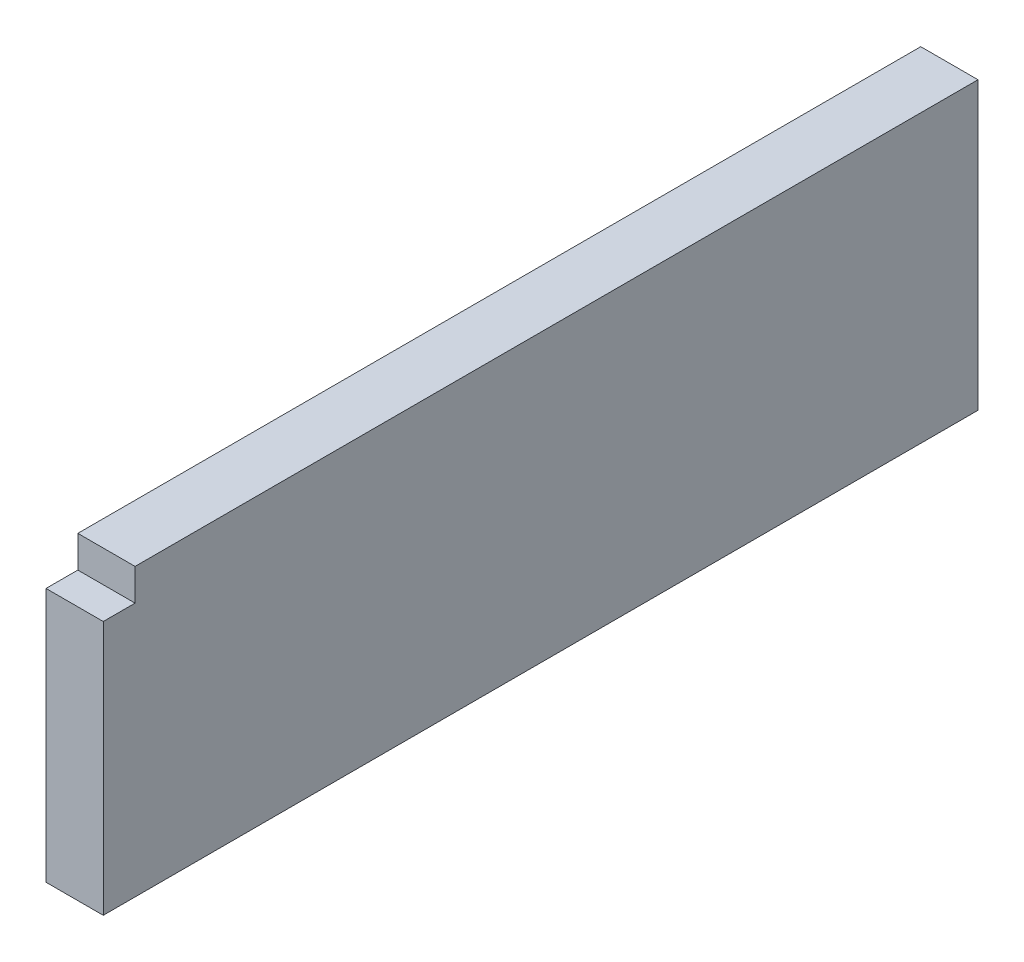
ISO-10303-21;
HEADER;
FILE_DESCRIPTION(('STEP AP214'),'2;1');
FILE_NAME('part.step','',(''),(''),'','','');
FILE_SCHEMA(('AUTOMOTIVE_DESIGN { 1 0 10303 214 1 1 1 1 }'));
ENDSEC;
DATA;
#1=APPLICATION_CONTEXT('core data for automotive mechanical design processes');
#2=APPLICATION_PROTOCOL_DEFINITION('international standard','automotive_design',2000,#1);
#3=PRODUCT_CONTEXT('',#1,'mechanical');
#4=PRODUCT('Part','Part','',(#3));
#5=PRODUCT_RELATED_PRODUCT_CATEGORY('part','',(#4));
#6=PRODUCT_DEFINITION_FORMATION('','',#4);
#7=PRODUCT_DEFINITION_CONTEXT('part definition',#1,'design');
#8=PRODUCT_DEFINITION('design','',#6,#7);
#9=PRODUCT_DEFINITION_SHAPE('','',#8);
#10=(LENGTH_UNIT() NAMED_UNIT(*) SI_UNIT(.MILLI.,.METRE.));
#11=(NAMED_UNIT(*) PLANE_ANGLE_UNIT() SI_UNIT($,.RADIAN.));
#12=(NAMED_UNIT(*) SI_UNIT($,.STERADIAN.) SOLID_ANGLE_UNIT());
#13=UNCERTAINTY_MEASURE_WITH_UNIT(LENGTH_MEASURE(1.E-05),#10,'distance_accuracy_value','');
#14=(GEOMETRIC_REPRESENTATION_CONTEXT(3) GLOBAL_UNCERTAINTY_ASSIGNED_CONTEXT((#13)) GLOBAL_UNIT_ASSIGNED_CONTEXT((#10,
#11,#12)) REPRESENTATION_CONTEXT('',''));
#15=CARTESIAN_POINT('',(0.,0.,0.));
#16=DIRECTION('',(0.,0.,1.));
#17=DIRECTION('',(1.,0.,0.));
#18=AXIS2_PLACEMENT_3D('',#15,#16,#17);
#19=CARTESIAN_POINT('',(9.,45.,127.5));
#20=DIRECTION('',(0.,-1.,0.));
#21=DIRECTION('',(0.,0.,-1.));
#22=AXIS2_PLACEMENT_3D('',#19,#20,#21);
#23=PLANE('',#22);
#24=DIRECTION('',(0.,0.,1.));
#25=VECTOR('',#24,1.);
#26=CARTESIAN_POINT('',(-9.,45.,127.5));
#27=LINE('',#26,#25);
#28=CARTESIAN_POINT('',(-9.,45.,-137.5));
#29=VERTEX_POINT('',#28);
#30=CARTESIAN_POINT('',(-9.,45.,127.5));
#31=VERTEX_POINT('',#30);
#32=EDGE_CURVE('E130',#29,#31,#27,.T.);
#33=ORIENTED_EDGE('',*,*,#32,.T.);
#34=DIRECTION('',(-1.,0.,0.));
#35=VECTOR('',#34,1.);
#36=CARTESIAN_POINT('',(9.,45.,127.5));
#37=LINE('',#36,#35);
#38=CARTESIAN_POINT('',(9.,45.,127.5));
#39=VERTEX_POINT('',#38);
#40=EDGE_CURVE('E11',#39,#31,#37,.T.);
#41=ORIENTED_EDGE('',*,*,#40,.F.);
#42=DIRECTION('',(0.,0.,1.));
#43=VECTOR('',#42,1.);
#44=CARTESIAN_POINT('',(9.,45.,127.5));
#45=LINE('',#44,#43);
#46=CARTESIAN_POINT('',(9.,45.,-137.5));
#47=VERTEX_POINT('',#46);
#48=EDGE_CURVE('E146',#47,#39,#45,.T.);
#49=ORIENTED_EDGE('',*,*,#48,.F.);
#50=DIRECTION('',(-1.,0.,0.));
#51=VECTOR('',#50,1.);
#52=CARTESIAN_POINT('',(9.,45.,-137.5));
#53=LINE('',#52,#51);
#54=EDGE_CURVE('E126',#47,#29,#53,.T.);
#55=ORIENTED_EDGE('',*,*,#54,.T.);
#56=EDGE_LOOP('',(#33,#41,#49,#55));
#57=FACE_BOUND('',#56,.T.);
#58=ADVANCED_FACE('F41',(#57),#23,.F.);
#59=CARTESIAN_POINT('',(9.,45.,127.5));
#60=DIRECTION('',(0.,0.,-1.));
#61=DIRECTION('',(-1.,0.,0.));
#62=AXIS2_PLACEMENT_3D('',#59,#60,#61);
#63=PLANE('',#62);
#64=DIRECTION('',(0.,-1.,0.));
#65=VECTOR('',#64,1.);
#66=CARTESIAN_POINT('',(-9.,45.,127.5));
#67=LINE('',#66,#65);
#68=CARTESIAN_POINT('',(-9.,35.,127.5));
#69=VERTEX_POINT('',#68);
#70=EDGE_CURVE('E134',#31,#69,#67,.T.);
#71=ORIENTED_EDGE('',*,*,#70,.T.);
#72=DIRECTION('',(-1.,0.,0.));
#73=VECTOR('',#72,1.);
#74=CARTESIAN_POINT('',(9.,35.,127.5));
#75=LINE('',#74,#73);
#76=CARTESIAN_POINT('',(9.,35.,127.5));
#77=VERTEX_POINT('',#76);
#78=EDGE_CURVE('E50',#77,#69,#75,.T.);
#79=ORIENTED_EDGE('',*,*,#78,.F.);
#80=DIRECTION('',(0.,-1.,0.));
#81=VECTOR('',#80,1.);
#82=CARTESIAN_POINT('',(9.,45.,127.5));
#83=LINE('',#82,#81);
#84=EDGE_CURVE('E95',#39,#77,#83,.T.);
#85=ORIENTED_EDGE('',*,*,#84,.F.);
#86=ORIENTED_EDGE('',*,*,#40,.T.);
#87=EDGE_LOOP('',(#71,#79,#85,#86));
#88=FACE_BOUND('',#87,.T.);
#89=ADVANCED_FACE('F174',(#88),#63,.F.);
#90=CARTESIAN_POINT('',(9.,35.,137.5));
#91=DIRECTION('',(0.,-1.,0.));
#92=DIRECTION('',(0.,0.,-1.));
#93=AXIS2_PLACEMENT_3D('',#90,#91,#92);
#94=PLANE('',#93);
#95=DIRECTION('',(0.,0.,1.));
#96=VECTOR('',#95,1.);
#97=CARTESIAN_POINT('',(-9.,35.,137.5));
#98=LINE('',#97,#96);
#99=CARTESIAN_POINT('',(-9.,35.,137.5));
#100=VERTEX_POINT('',#99);
#101=EDGE_CURVE('E137',#69,#100,#98,.T.);
#102=ORIENTED_EDGE('',*,*,#101,.T.);
#103=DIRECTION('',(-1.,0.,0.));
#104=VECTOR('',#103,1.);
#105=CARTESIAN_POINT('',(9.,35.,137.5));
#106=LINE('',#105,#104);
#107=CARTESIAN_POINT('',(9.,35.,137.5));
#108=VERTEX_POINT('',#107);
#109=EDGE_CURVE('E119',#108,#100,#106,.T.);
#110=ORIENTED_EDGE('',*,*,#109,.F.);
#111=DIRECTION('',(0.,0.,1.));
#112=VECTOR('',#111,1.);
#113=CARTESIAN_POINT('',(9.,35.,137.5));
#114=LINE('',#113,#112);
#115=EDGE_CURVE('E108',#77,#108,#114,.T.);
#116=ORIENTED_EDGE('',*,*,#115,.F.);
#117=ORIENTED_EDGE('',*,*,#78,.T.);
#118=EDGE_LOOP('',(#102,#110,#116,#117));
#119=FACE_BOUND('',#118,.T.);
#120=ADVANCED_FACE('F156',(#119),#94,.F.);
#121=CARTESIAN_POINT('',(9.,35.,137.5));
#122=DIRECTION('',(0.,0.,-1.));
#123=DIRECTION('',(-1.,0.,0.));
#124=AXIS2_PLACEMENT_3D('',#121,#122,#123);
#125=PLANE('',#124);
#126=DIRECTION('',(0.,-1.,0.));
#127=VECTOR('',#126,1.);
#128=CARTESIAN_POINT('',(-9.,35.,137.5));
#129=LINE('',#128,#127);
#130=CARTESIAN_POINT('',(-9.,-45.,137.5));
#131=VERTEX_POINT('',#130);
#132=EDGE_CURVE('E117',#100,#131,#129,.T.);
#133=ORIENTED_EDGE('',*,*,#132,.T.);
#134=DIRECTION('',(-1.,0.,0.));
#135=VECTOR('',#134,1.);
#136=CARTESIAN_POINT('',(9.,-45.,137.5));
#137=LINE('',#136,#135);
#138=CARTESIAN_POINT('',(9.,-45.,137.5));
#139=VERTEX_POINT('',#138);
#140=EDGE_CURVE('E114',#139,#131,#137,.T.);
#141=ORIENTED_EDGE('',*,*,#140,.F.);
#142=DIRECTION('',(0.,-1.,0.));
#143=VECTOR('',#142,1.);
#144=CARTESIAN_POINT('',(9.,35.,137.5));
#145=LINE('',#144,#143);
#146=EDGE_CURVE('E102',#108,#139,#145,.T.);
#147=ORIENTED_EDGE('',*,*,#146,.F.);
#148=ORIENTED_EDGE('',*,*,#109,.T.);
#149=EDGE_LOOP('',(#133,#141,#147,#148));
#150=FACE_BOUND('',#149,.T.);
#151=ADVANCED_FACE('F115',(#150),#125,.F.);
#152=CARTESIAN_POINT('',(9.,-45.,137.5));
#153=DIRECTION('',(0.,1.,0.));
#154=DIRECTION('',(0.,0.,1.));
#155=AXIS2_PLACEMENT_3D('',#152,#153,#154);
#156=PLANE('',#155);
#157=DIRECTION('',(0.,0.,-1.));
#158=VECTOR('',#157,1.);
#159=CARTESIAN_POINT('',(-9.,-45.,137.5));
#160=LINE('',#159,#158);
#161=CARTESIAN_POINT('',(-9.,-45.,-137.5));
#162=VERTEX_POINT('',#161);
#163=EDGE_CURVE('E81',#131,#162,#160,.T.);
#164=ORIENTED_EDGE('',*,*,#163,.T.);
#165=DIRECTION('',(-1.,0.,0.));
#166=VECTOR('',#165,1.);
#167=CARTESIAN_POINT('',(9.,-45.,-137.5));
#168=LINE('',#167,#166);
#169=CARTESIAN_POINT('',(9.,-45.,-137.5));
#170=VERTEX_POINT('',#169);
#171=EDGE_CURVE('E120',#170,#162,#168,.T.);
#172=ORIENTED_EDGE('',*,*,#171,.F.);
#173=DIRECTION('',(0.,0.,-1.));
#174=VECTOR('',#173,1.);
#175=CARTESIAN_POINT('',(9.,-45.,137.5));
#176=LINE('',#175,#174);
#177=EDGE_CURVE('E106',#139,#170,#176,.T.);
#178=ORIENTED_EDGE('',*,*,#177,.F.);
#179=ORIENTED_EDGE('',*,*,#140,.T.);
#180=EDGE_LOOP('',(#164,#172,#178,#179));
#181=FACE_BOUND('',#180,.T.);
#182=ADVANCED_FACE('F122',(#181),#156,.F.);
#183=CARTESIAN_POINT('',(9.,-45.,-137.5));
#184=DIRECTION('',(0.,0.,1.));
#185=DIRECTION('',(1.,0.,0.));
#186=AXIS2_PLACEMENT_3D('',#183,#184,#185);
#187=PLANE('',#186);
#188=DIRECTION('',(0.,1.,0.));
#189=VECTOR('',#188,1.);
#190=CARTESIAN_POINT('',(-9.,-45.,-137.5));
#191=LINE('',#190,#189);
#192=EDGE_CURVE('E87',#162,#29,#191,.T.);
#193=ORIENTED_EDGE('',*,*,#192,.T.);
#194=ORIENTED_EDGE('',*,*,#54,.F.);
#195=DIRECTION('',(0.,1.,0.));
#196=VECTOR('',#195,1.);
#197=CARTESIAN_POINT('',(9.,-45.,-137.5));
#198=LINE('',#197,#196);
#199=EDGE_CURVE('E58',#170,#47,#198,.T.);
#200=ORIENTED_EDGE('',*,*,#199,.F.);
#201=ORIENTED_EDGE('',*,*,#171,.T.);
#202=EDGE_LOOP('',(#193,#194,#200,#201));
#203=FACE_BOUND('',#202,.T.);
#204=ADVANCED_FACE('F163',(#203),#187,.F.);
#205=CARTESIAN_POINT('',(9.,0.,0.));
#206=DIRECTION('',(1.,0.,0.));
#207=DIRECTION('',(0.,0.,-1.));
#208=AXIS2_PLACEMENT_3D('',#205,#206,#207);
#209=PLANE('',#208);
#210=ORIENTED_EDGE('',*,*,#48,.T.);
#211=ORIENTED_EDGE('',*,*,#84,.T.);
#212=ORIENTED_EDGE('',*,*,#115,.T.);
#213=ORIENTED_EDGE('',*,*,#146,.T.);
#214=ORIENTED_EDGE('',*,*,#177,.T.);
#215=ORIENTED_EDGE('',*,*,#199,.T.);
#216=EDGE_LOOP('',(#210,#211,#212,#213,#214,#215));
#217=FACE_BOUND('',#216,.T.);
#218=ADVANCED_FACE('F104',(#217),#209,.T.);
#219=CARTESIAN_POINT('',(-9.,0.,0.));
#220=DIRECTION('',(1.,0.,0.));
#221=DIRECTION('',(0.,0.,-1.));
#222=AXIS2_PLACEMENT_3D('',#219,#220,#221);
#223=PLANE('',#222);
#224=ORIENTED_EDGE('',*,*,#32,.F.);
#225=ORIENTED_EDGE('',*,*,#192,.F.);
#226=ORIENTED_EDGE('',*,*,#163,.F.);
#227=ORIENTED_EDGE('',*,*,#132,.F.);
#228=ORIENTED_EDGE('',*,*,#101,.F.);
#229=ORIENTED_EDGE('',*,*,#70,.F.);
#230=EDGE_LOOP('',(#224,#225,#226,#227,#228,#229));
#231=FACE_BOUND('',#230,.T.);
#232=ADVANCED_FACE('F159',(#231),#223,.F.);
#233=CLOSED_SHELL('',(#58,#89,#120,#151,#182,#204,#218,#232));
#234=MANIFOLD_SOLID_BREP('B2',#233);
#235=ADVANCED_BREP_SHAPE_REPRESENTATION('',(#18,#234),#14);
#236=SHAPE_DEFINITION_REPRESENTATION(#9,#235);
ENDSEC;
END-ISO-10303-21;
